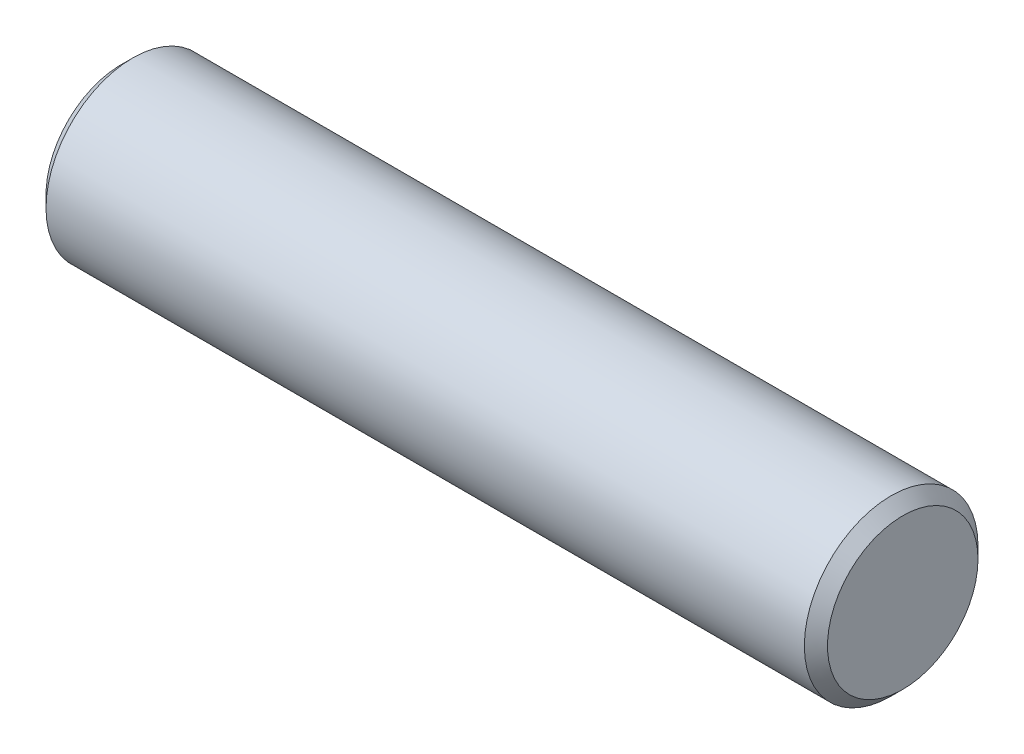
ISO-10303-21;
HEADER;
FILE_DESCRIPTION(('STEP AP214'),'2;1');
FILE_NAME('part.step','',(''),(''),'','','');
FILE_SCHEMA(('AUTOMOTIVE_DESIGN { 1 0 10303 214 1 1 1 1 }'));
ENDSEC;
DATA;
#1=APPLICATION_CONTEXT('core data for automotive mechanical design processes');
#2=APPLICATION_PROTOCOL_DEFINITION('international standard','automotive_design',2000,#1);
#3=PRODUCT_CONTEXT('',#1,'mechanical');
#4=PRODUCT('Part','Part','',(#3));
#5=PRODUCT_RELATED_PRODUCT_CATEGORY('part','',(#4));
#6=PRODUCT_DEFINITION_FORMATION('','',#4);
#7=PRODUCT_DEFINITION_CONTEXT('part definition',#1,'design');
#8=PRODUCT_DEFINITION('design','',#6,#7);
#9=PRODUCT_DEFINITION_SHAPE('','',#8);
#10=(LENGTH_UNIT() NAMED_UNIT(*) SI_UNIT(.MILLI.,.METRE.));
#11=(NAMED_UNIT(*) PLANE_ANGLE_UNIT() SI_UNIT($,.RADIAN.));
#12=(NAMED_UNIT(*) SI_UNIT($,.STERADIAN.) SOLID_ANGLE_UNIT());
#13=UNCERTAINTY_MEASURE_WITH_UNIT(LENGTH_MEASURE(1.E-05),#10,'distance_accuracy_value','');
#14=(GEOMETRIC_REPRESENTATION_CONTEXT(3) GLOBAL_UNCERTAINTY_ASSIGNED_CONTEXT((#13)) GLOBAL_UNIT_ASSIGNED_CONTEXT((#10,
#11,#12)) REPRESENTATION_CONTEXT('',''));
#15=CARTESIAN_POINT('',(0.,0.,0.));
#16=DIRECTION('',(0.,0.,1.));
#17=DIRECTION('',(1.,0.,0.));
#18=AXIS2_PLACEMENT_3D('',#15,#16,#17);
#19=CARTESIAN_POINT('',(6.75,0.,0.));
#20=DIRECTION('',(-1.,0.,0.));
#21=DIRECTION('',(0.,0.,1.));
#22=AXIS2_PLACEMENT_3D('',#19,#20,#21);
#23=CYLINDRICAL_SURFACE('',#22,1.5);
#24=CARTESIAN_POINT('',(-6.55,0.,0.));
#25=DIRECTION('',(1.,0.,0.));
#26=DIRECTION('',(0.,0.,-1.));
#27=AXIS2_PLACEMENT_3D('',#24,#25,#26);
#28=CIRCLE('',#27,1.5);
#29=CARTESIAN_POINT('',(-6.55,0.,-1.5));
#30=VERTEX_POINT('',#29);
#31=EDGE_CURVE('E53',#30,#30,#28,.T.);
#32=ORIENTED_EDGE('',*,*,#31,.T.);
#33=EDGE_LOOP('',(#32));
#34=FACE_BOUND('',#33,.T.);
#35=CARTESIAN_POINT('',(6.55,0.,0.));
#36=DIRECTION('',(1.,0.,0.));
#37=DIRECTION('',(0.,0.,-1.));
#38=AXIS2_PLACEMENT_3D('',#35,#36,#37);
#39=CIRCLE('',#38,1.5);
#40=CARTESIAN_POINT('',(6.55,0.,-1.5));
#41=VERTEX_POINT('',#40);
#42=EDGE_CURVE('E58',#41,#41,#39,.F.);
#43=ORIENTED_EDGE('',*,*,#42,.T.);
#44=EDGE_LOOP('',(#43));
#45=FACE_BOUND('',#44,.T.);
#46=ADVANCED_FACE('F39',(#34,#45),#23,.T.);
#47=CARTESIAN_POINT('',(6.75,0.,0.));
#48=DIRECTION('',(1.,0.,0.));
#49=DIRECTION('',(0.,0.,-1.));
#50=AXIS2_PLACEMENT_3D('',#47,#48,#49);
#51=PLANE('',#50);
#52=CARTESIAN_POINT('',(6.75,0.,0.));
#53=DIRECTION('',(1.,0.,0.));
#54=DIRECTION('',(0.,0.,-1.));
#55=AXIS2_PLACEMENT_3D('',#52,#53,#54);
#56=CIRCLE('',#55,1.30000000000001);
#57=CARTESIAN_POINT('',(6.75,0.,-1.30000000000001));
#58=VERTEX_POINT('',#57);
#59=EDGE_CURVE('E10',#58,#58,#56,.T.);
#60=ORIENTED_EDGE('',*,*,#59,.T.);
#61=EDGE_LOOP('',(#60));
#62=FACE_BOUND('',#61,.T.);
#63=ADVANCED_FACE('F75',(#62),#51,.T.);
#64=CARTESIAN_POINT('',(-6.75,0.,0.));
#65=DIRECTION('',(1.,0.,0.));
#66=DIRECTION('',(0.,0.,-1.));
#67=AXIS2_PLACEMENT_3D('',#64,#65,#66);
#68=PLANE('',#67);
#69=CARTESIAN_POINT('',(-6.75,0.,0.));
#70=DIRECTION('',(1.,0.,0.));
#71=DIRECTION('',(0.,0.,-1.));
#72=AXIS2_PLACEMENT_3D('',#69,#70,#71);
#73=CIRCLE('',#72,1.3);
#74=CARTESIAN_POINT('',(-6.75,0.,-1.3));
#75=VERTEX_POINT('',#74);
#76=EDGE_CURVE('E48',#75,#75,#73,.F.);
#77=ORIENTED_EDGE('',*,*,#76,.T.);
#78=EDGE_LOOP('',(#77));
#79=FACE_BOUND('',#78,.T.);
#80=ADVANCED_FACE('F72',(#79),#68,.F.);
#81=CARTESIAN_POINT('',(-6.55,0.,0.));
#82=DIRECTION('',(1.,0.,0.));
#83=DIRECTION('',(0.,0.,-1.));
#84=AXIS2_PLACEMENT_3D('',#81,#82,#83);
#85=CONICAL_SURFACE('',#84,1.5,0.78539816339745);
#86=ORIENTED_EDGE('',*,*,#76,.F.);
#87=EDGE_LOOP('',(#86));
#88=FACE_BOUND('',#87,.T.);
#89=ORIENTED_EDGE('',*,*,#31,.F.);
#90=EDGE_LOOP('',(#89));
#91=FACE_BOUND('',#90,.T.);
#92=ADVANCED_FACE('F68',(#88,#91),#85,.T.);
#93=CARTESIAN_POINT('',(6.75,0.,0.));
#94=DIRECTION('',(-1.,0.,0.));
#95=DIRECTION('',(0.,0.,1.));
#96=AXIS2_PLACEMENT_3D('',#93,#94,#95);
#97=CONICAL_SURFACE('',#96,1.30000000000001,0.785398163397446);
#98=ORIENTED_EDGE('',*,*,#42,.F.);
#99=EDGE_LOOP('',(#98));
#100=FACE_BOUND('',#99,.T.);
#101=ORIENTED_EDGE('',*,*,#59,.F.);
#102=EDGE_LOOP('',(#101));
#103=FACE_BOUND('',#102,.T.);
#104=ADVANCED_FACE('F42',(#100,#103),#97,.T.);
#105=CLOSED_SHELL('',(#46,#63,#80,#92,#104));
#106=MANIFOLD_SOLID_BREP('B2',#105);
#107=ADVANCED_BREP_SHAPE_REPRESENTATION('',(#18,#106),#14);
#108=SHAPE_DEFINITION_REPRESENTATION(#9,#107);
ENDSEC;
END-ISO-10303-21;
